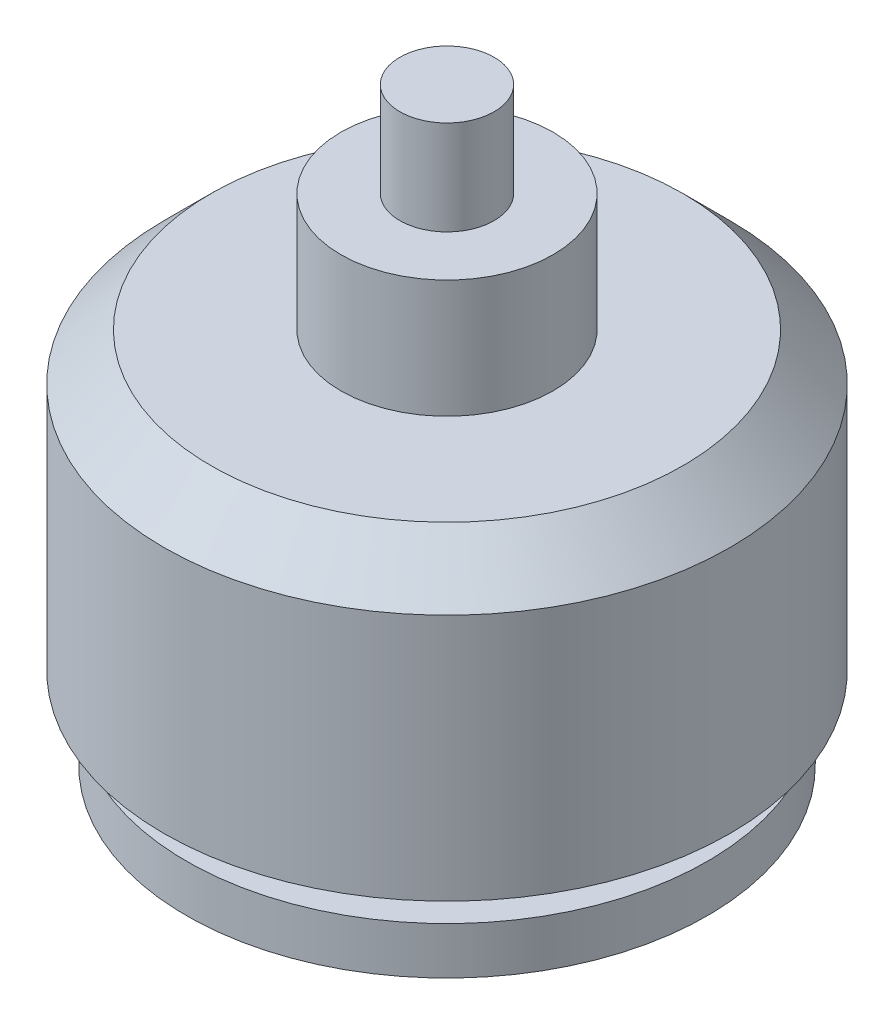
ISO-10303-21;
HEADER;
FILE_DESCRIPTION(('STEP AP214'),'2;1');
FILE_NAME('part.step','',(''),(''),'','','');
FILE_SCHEMA(('AUTOMOTIVE_DESIGN { 1 0 10303 214 1 1 1 1 }'));
ENDSEC;
DATA;
#1=APPLICATION_CONTEXT('core data for automotive mechanical design processes');
#2=APPLICATION_PROTOCOL_DEFINITION('international standard','automotive_design',2000,#1);
#3=PRODUCT_CONTEXT('',#1,'mechanical');
#4=PRODUCT('Part','Part','',(#3));
#5=PRODUCT_RELATED_PRODUCT_CATEGORY('part','',(#4));
#6=PRODUCT_DEFINITION_FORMATION('','',#4);
#7=PRODUCT_DEFINITION_CONTEXT('part definition',#1,'design');
#8=PRODUCT_DEFINITION('design','',#6,#7);
#9=PRODUCT_DEFINITION_SHAPE('','',#8);
#10=(LENGTH_UNIT() NAMED_UNIT(*) SI_UNIT(.MILLI.,.METRE.));
#11=(NAMED_UNIT(*) PLANE_ANGLE_UNIT() SI_UNIT($,.RADIAN.));
#12=(NAMED_UNIT(*) SI_UNIT($,.STERADIAN.) SOLID_ANGLE_UNIT());
#13=UNCERTAINTY_MEASURE_WITH_UNIT(LENGTH_MEASURE(1.E-05),#10,'distance_accuracy_value','');
#14=(GEOMETRIC_REPRESENTATION_CONTEXT(3) GLOBAL_UNCERTAINTY_ASSIGNED_CONTEXT((#13)) GLOBAL_UNIT_ASSIGNED_CONTEXT((#10,
#11,#12)) REPRESENTATION_CONTEXT('',''));
#15=CARTESIAN_POINT('',(0.,0.,0.));
#16=DIRECTION('',(0.,0.,1.));
#17=DIRECTION('',(1.,0.,0.));
#18=AXIS2_PLACEMENT_3D('',#15,#16,#17);
#19=CARTESIAN_POINT('',(0.,0.,0.));
#20=DIRECTION('',(0.,-1.,0.));
#21=DIRECTION('',(0.,0.,-1.));
#22=AXIS2_PLACEMENT_3D('',#19,#20,#21);
#23=PLANE('',#22);
#24=CARTESIAN_POINT('',(0.,0.,0.));
#25=DIRECTION('',(0.,-1.,0.));
#26=DIRECTION('',(0.,0.,-1.));
#27=AXIS2_PLACEMENT_3D('',#24,#25,#26);
#28=CIRCLE('',#27,22.08);
#29=CARTESIAN_POINT('',(0.,0.,-22.08));
#30=VERTEX_POINT('',#29);
#31=EDGE_CURVE('E10',#30,#30,#28,.T.);
#32=ORIENTED_EDGE('',*,*,#31,.T.);
#33=EDGE_LOOP('',(#32));
#34=FACE_BOUND('',#33,.T.);
#35=ADVANCED_FACE('F37',(#34),#23,.T.);
#36=CARTESIAN_POINT('',(0.,-10.,0.));
#37=DIRECTION('',(0.,-1.,0.));
#38=DIRECTION('',(0.,0.,-1.));
#39=AXIS2_PLACEMENT_3D('',#36,#37,#38);
#40=CYLINDRICAL_SURFACE('',#39,22.08);
#41=CARTESIAN_POINT('',(0.,4.,0.));
#42=DIRECTION('',(0.,-1.,0.));
#43=DIRECTION('',(0.,0.,-1.));
#44=AXIS2_PLACEMENT_3D('',#41,#42,#43);
#45=CIRCLE('',#44,22.08);
#46=CARTESIAN_POINT('',(0.,4.,-22.08));
#47=VERTEX_POINT('',#46);
#48=EDGE_CURVE('E43',#47,#47,#45,.T.);
#49=ORIENTED_EDGE('',*,*,#48,.T.);
#50=EDGE_LOOP('',(#49));
#51=FACE_BOUND('',#50,.T.);
#52=ORIENTED_EDGE('',*,*,#31,.F.);
#53=EDGE_LOOP('',(#52));
#54=FACE_BOUND('',#53,.T.);
#55=ADVANCED_FACE('F90',(#51,#54),#40,.T.);
#56=CARTESIAN_POINT('',(22.08,4.,0.));
#57=DIRECTION('',(0.,1.,0.));
#58=DIRECTION('',(0.,0.,1.));
#59=AXIS2_PLACEMENT_3D('',#56,#57,#58);
#60=PLANE('',#59);
#61=CARTESIAN_POINT('',(0.,4.,0.));
#62=DIRECTION('',(0.,-1.,0.));
#63=DIRECTION('',(0.,0.,-1.));
#64=AXIS2_PLACEMENT_3D('',#61,#62,#63);
#65=CIRCLE('',#64,16.8);
#66=CARTESIAN_POINT('',(0.,4.,-16.8));
#67=VERTEX_POINT('',#66);
#68=EDGE_CURVE('E47',#67,#67,#65,.T.);
#69=ORIENTED_EDGE('',*,*,#68,.T.);
#70=EDGE_LOOP('',(#69));
#71=FACE_BOUND('',#70,.T.);
#72=ORIENTED_EDGE('',*,*,#48,.F.);
#73=EDGE_LOOP('',(#72));
#74=FACE_BOUND('',#73,.T.);
#75=ADVANCED_FACE('F94',(#71,#74),#60,.T.);
#76=CARTESIAN_POINT('',(0.,-10.,0.));
#77=DIRECTION('',(0.,-1.,0.));
#78=DIRECTION('',(0.,0.,-1.));
#79=AXIS2_PLACEMENT_3D('',#76,#77,#78);
#80=CYLINDRICAL_SURFACE('',#79,16.8);
#81=CARTESIAN_POINT('',(0.,7.,0.));
#82=DIRECTION('',(0.,-1.,0.));
#83=DIRECTION('',(0.,0.,-1.));
#84=AXIS2_PLACEMENT_3D('',#81,#82,#83);
#85=CIRCLE('',#84,16.8);
#86=CARTESIAN_POINT('',(0.,7.,-16.8));
#87=VERTEX_POINT('',#86);
#88=EDGE_CURVE('E51',#87,#87,#85,.T.);
#89=ORIENTED_EDGE('',*,*,#88,.T.);
#90=EDGE_LOOP('',(#89));
#91=FACE_BOUND('',#90,.T.);
#92=ORIENTED_EDGE('',*,*,#68,.F.);
#93=EDGE_LOOP('',(#92));
#94=FACE_BOUND('',#93,.T.);
#95=ADVANCED_FACE('F98',(#91,#94),#80,.T.);
#96=CARTESIAN_POINT('',(16.8,7.,0.));
#97=DIRECTION('',(0.,-1.,0.));
#98=DIRECTION('',(0.,0.,-1.));
#99=AXIS2_PLACEMENT_3D('',#96,#97,#98);
#100=PLANE('',#99);
#101=CARTESIAN_POINT('',(0.,7.,0.));
#102=DIRECTION('',(0.,-1.,0.));
#103=DIRECTION('',(0.,0.,-1.));
#104=AXIS2_PLACEMENT_3D('',#101,#102,#103);
#105=CIRCLE('',#104,24.);
#106=CARTESIAN_POINT('',(0.,7.,-24.));
#107=VERTEX_POINT('',#106);
#108=EDGE_CURVE('E56',#107,#107,#105,.T.);
#109=ORIENTED_EDGE('',*,*,#108,.T.);
#110=EDGE_LOOP('',(#109));
#111=FACE_BOUND('',#110,.T.);
#112=ORIENTED_EDGE('',*,*,#88,.F.);
#113=EDGE_LOOP('',(#112));
#114=FACE_BOUND('',#113,.T.);
#115=ADVANCED_FACE('F105',(#111,#114),#100,.T.);
#116=CARTESIAN_POINT('',(0.,-10.,0.));
#117=DIRECTION('',(0.,-1.,0.));
#118=DIRECTION('',(0.,0.,-1.));
#119=AXIS2_PLACEMENT_3D('',#116,#117,#118);
#120=CYLINDRICAL_SURFACE('',#119,24.);
#121=CARTESIAN_POINT('',(0.,28.,0.));
#122=DIRECTION('',(0.,-1.,0.));
#123=DIRECTION('',(0.,0.,-1.));
#124=AXIS2_PLACEMENT_3D('',#121,#122,#123);
#125=CIRCLE('',#124,24.);
#126=CARTESIAN_POINT('',(0.,28.,-24.));
#127=VERTEX_POINT('',#126);
#128=EDGE_CURVE('E59',#127,#127,#125,.T.);
#129=ORIENTED_EDGE('',*,*,#128,.T.);
#130=EDGE_LOOP('',(#129));
#131=FACE_BOUND('',#130,.T.);
#132=ORIENTED_EDGE('',*,*,#108,.F.);
#133=EDGE_LOOP('',(#132));
#134=FACE_BOUND('',#133,.T.);
#135=ADVANCED_FACE('F109',(#131,#134),#120,.T.);
#136=CARTESIAN_POINT('',(0.,28.,0.));
#137=DIRECTION('',(0.,-1.,0.));
#138=DIRECTION('',(0.,0.,-1.));
#139=AXIS2_PLACEMENT_3D('',#136,#137,#138);
#140=CONICAL_SURFACE('',#139,24.,0.785398163397448);
#141=CARTESIAN_POINT('',(0.,32.,0.));
#142=DIRECTION('',(0.,-1.,0.));
#143=DIRECTION('',(0.,0.,-1.));
#144=AXIS2_PLACEMENT_3D('',#141,#142,#143);
#145=CIRCLE('',#144,20.);
#146=CARTESIAN_POINT('',(0.,32.,-20.));
#147=VERTEX_POINT('',#146);
#148=EDGE_CURVE('E62',#147,#147,#145,.T.);
#149=ORIENTED_EDGE('',*,*,#148,.T.);
#150=EDGE_LOOP('',(#149));
#151=FACE_BOUND('',#150,.T.);
#152=ORIENTED_EDGE('',*,*,#128,.F.);
#153=EDGE_LOOP('',(#152));
#154=FACE_BOUND('',#153,.T.);
#155=ADVANCED_FACE('F113',(#151,#154),#140,.T.);
#156=CARTESIAN_POINT('',(20.,32.,0.));
#157=DIRECTION('',(0.,1.,0.));
#158=DIRECTION('',(0.,0.,1.));
#159=AXIS2_PLACEMENT_3D('',#156,#157,#158);
#160=PLANE('',#159);
#161=CARTESIAN_POINT('',(0.,32.,0.));
#162=DIRECTION('',(0.,-1.,0.));
#163=DIRECTION('',(0.,0.,-1.));
#164=AXIS2_PLACEMENT_3D('',#161,#162,#163);
#165=CIRCLE('',#164,9.);
#166=CARTESIAN_POINT('',(0.,32.,-9.));
#167=VERTEX_POINT('',#166);
#168=EDGE_CURVE('E65',#167,#167,#165,.T.);
#169=ORIENTED_EDGE('',*,*,#168,.T.);
#170=EDGE_LOOP('',(#169));
#171=FACE_BOUND('',#170,.T.);
#172=ORIENTED_EDGE('',*,*,#148,.F.);
#173=EDGE_LOOP('',(#172));
#174=FACE_BOUND('',#173,.T.);
#175=ADVANCED_FACE('F117',(#171,#174),#160,.T.);
#176=CARTESIAN_POINT('',(0.,-10.,0.));
#177=DIRECTION('',(0.,-1.,0.));
#178=DIRECTION('',(0.,0.,-1.));
#179=AXIS2_PLACEMENT_3D('',#176,#177,#178);
#180=CYLINDRICAL_SURFACE('',#179,9.);
#181=CARTESIAN_POINT('',(0.,42.,0.));
#182=DIRECTION('',(0.,-1.,0.));
#183=DIRECTION('',(0.,0.,-1.));
#184=AXIS2_PLACEMENT_3D('',#181,#182,#183);
#185=CIRCLE('',#184,9.);
#186=CARTESIAN_POINT('',(0.,42.,-9.));
#187=VERTEX_POINT('',#186);
#188=EDGE_CURVE('E68',#187,#187,#185,.T.);
#189=ORIENTED_EDGE('',*,*,#188,.T.);
#190=EDGE_LOOP('',(#189));
#191=FACE_BOUND('',#190,.T.);
#192=ORIENTED_EDGE('',*,*,#168,.F.);
#193=EDGE_LOOP('',(#192));
#194=FACE_BOUND('',#193,.T.);
#195=ADVANCED_FACE('F121',(#191,#194),#180,.T.);
#196=CARTESIAN_POINT('',(9.,42.,0.));
#197=DIRECTION('',(0.,1.,0.));
#198=DIRECTION('',(0.,0.,1.));
#199=AXIS2_PLACEMENT_3D('',#196,#197,#198);
#200=PLANE('',#199);
#201=CARTESIAN_POINT('',(0.,42.,0.));
#202=DIRECTION('',(0.,-1.,0.));
#203=DIRECTION('',(0.,0.,-1.));
#204=AXIS2_PLACEMENT_3D('',#201,#202,#203);
#205=CIRCLE('',#204,4.);
#206=CARTESIAN_POINT('',(0.,42.,-4.));
#207=VERTEX_POINT('',#206);
#208=EDGE_CURVE('E71',#207,#207,#205,.T.);
#209=ORIENTED_EDGE('',*,*,#208,.T.);
#210=EDGE_LOOP('',(#209));
#211=FACE_BOUND('',#210,.T.);
#212=ORIENTED_EDGE('',*,*,#188,.F.);
#213=EDGE_LOOP('',(#212));
#214=FACE_BOUND('',#213,.T.);
#215=ADVANCED_FACE('F87',(#211,#214),#200,.T.);
#216=CARTESIAN_POINT('',(0.,-10.,0.));
#217=DIRECTION('',(0.,-1.,0.));
#218=DIRECTION('',(0.,0.,-1.));
#219=AXIS2_PLACEMENT_3D('',#216,#217,#218);
#220=CYLINDRICAL_SURFACE('',#219,4.);
#221=CARTESIAN_POINT('',(0.,50.,0.));
#222=DIRECTION('',(0.,-1.,0.));
#223=DIRECTION('',(0.,0.,-1.));
#224=AXIS2_PLACEMENT_3D('',#221,#222,#223);
#225=CIRCLE('',#224,4.);
#226=CARTESIAN_POINT('',(0.,50.,-4.));
#227=VERTEX_POINT('',#226);
#228=EDGE_CURVE('E74',#227,#227,#225,.T.);
#229=ORIENTED_EDGE('',*,*,#228,.T.);
#230=EDGE_LOOP('',(#229));
#231=FACE_BOUND('',#230,.T.);
#232=ORIENTED_EDGE('',*,*,#208,.F.);
#233=EDGE_LOOP('',(#232));
#234=FACE_BOUND('',#233,.T.);
#235=ADVANCED_FACE('F78',(#231,#234),#220,.T.);
#236=CARTESIAN_POINT('',(4.,50.,0.));
#237=DIRECTION('',(0.,1.,0.));
#238=DIRECTION('',(0.,0.,1.));
#239=AXIS2_PLACEMENT_3D('',#236,#237,#238);
#240=PLANE('',#239);
#241=ORIENTED_EDGE('',*,*,#228,.F.);
#242=EDGE_LOOP('',(#241));
#243=FACE_BOUND('',#242,.T.);
#244=ADVANCED_FACE('F81',(#243),#240,.T.);
#245=CLOSED_SHELL('',(#35,#55,#75,#95,#115,#135,#155,#175,#195,#215,#235,#244));
#246=MANIFOLD_SOLID_BREP('B2',#245);
#247=ADVANCED_BREP_SHAPE_REPRESENTATION('',(#18,#246),#14);
#248=SHAPE_DEFINITION_REPRESENTATION(#9,#247);
ENDSEC;
END-ISO-10303-21;
